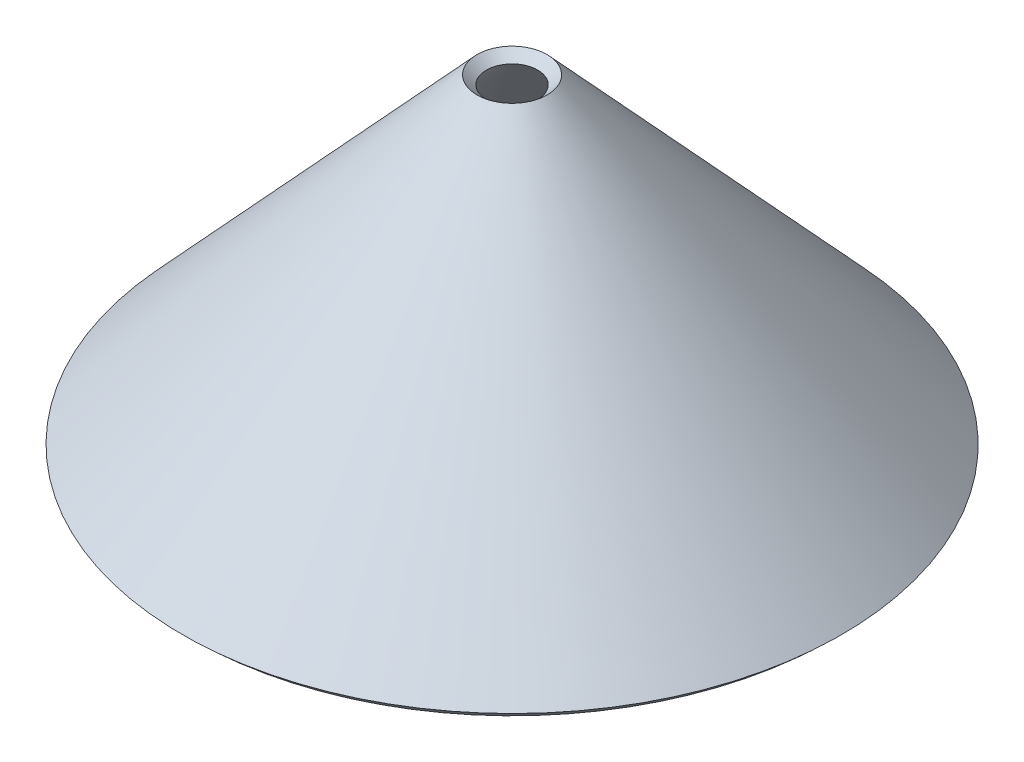
ISO-10303-21;
HEADER;
FILE_DESCRIPTION(('STEP AP214'),'2;1');
FILE_NAME('part.step','',(''),(''),'','','');
FILE_SCHEMA(('AUTOMOTIVE_DESIGN { 1 0 10303 214 1 1 1 1 }'));
ENDSEC;
DATA;
#1=APPLICATION_CONTEXT('core data for automotive mechanical design processes');
#2=APPLICATION_PROTOCOL_DEFINITION('international standard','automotive_design',2000,#1);
#3=PRODUCT_CONTEXT('',#1,'mechanical');
#4=PRODUCT('Part','Part','',(#3));
#5=PRODUCT_RELATED_PRODUCT_CATEGORY('part','',(#4));
#6=PRODUCT_DEFINITION_FORMATION('','',#4);
#7=PRODUCT_DEFINITION_CONTEXT('part definition',#1,'design');
#8=PRODUCT_DEFINITION('design','',#6,#7);
#9=PRODUCT_DEFINITION_SHAPE('','',#8);
#10=(LENGTH_UNIT() NAMED_UNIT(*) SI_UNIT(.MILLI.,.METRE.));
#11=(NAMED_UNIT(*) PLANE_ANGLE_UNIT() SI_UNIT($,.RADIAN.));
#12=(NAMED_UNIT(*) SI_UNIT($,.STERADIAN.) SOLID_ANGLE_UNIT());
#13=UNCERTAINTY_MEASURE_WITH_UNIT(LENGTH_MEASURE(1.E-05),#10,'distance_accuracy_value','');
#14=(GEOMETRIC_REPRESENTATION_CONTEXT(3) GLOBAL_UNCERTAINTY_ASSIGNED_CONTEXT((#13)) GLOBAL_UNIT_ASSIGNED_CONTEXT((#10,
#11,#12)) REPRESENTATION_CONTEXT('',''));
#15=CARTESIAN_POINT('',(0.,0.,0.));
#16=DIRECTION('',(0.,0.,1.));
#17=DIRECTION('',(1.,0.,0.));
#18=AXIS2_PLACEMENT_3D('',#15,#16,#17);
#19=CARTESIAN_POINT('',(0.,17.1972358828504,0.));
#20=DIRECTION('',(0.,-1.,0.));
#21=DIRECTION('',(0.,0.,-1.));
#22=AXIS2_PLACEMENT_3D('',#19,#20,#21);
#23=CONICAL_SURFACE('',#22,69.4926476987505,0.74375558429886);
#24=CARTESIAN_POINT('',(0.,-617.80276411715,0.));
#25=DIRECTION('',(0.,1.,0.));
#26=DIRECTION('',(0.,0.,1.));
#27=AXIS2_PLACEMENT_3D('',#24,#25,#26);
#28=CIRCLE('',#27,653.69264769875);
#29=CARTESIAN_POINT('',(0.,-617.80276411715,-653.692647698751));
#30=VERTEX_POINT('',#29);
#31=EDGE_CURVE('E54',#30,#30,#28,.T.);
#32=CARTESIAN_POINT('',(0.,17.1972358828504,0.));
#33=DIRECTION('',(0.,1.,0.));
#34=DIRECTION('',(0.,0.,1.));
#35=AXIS2_PLACEMENT_3D('',#32,#33,#34);
#36=CIRCLE('',#35,69.4926476987505);
#37=CARTESIAN_POINT('',(0.,17.1972358828504,-69.4926476987505));
#38=VERTEX_POINT('',#37);
#39=EDGE_CURVE('E12',#38,#38,#36,.T.);
#40=CARTESIAN_POINT('',(0.,-617.80276411715,-653.692647698751));
#41=CARTESIAN_POINT('',(0.,-611.188180783816,-647.607231032084));
#42=CARTESIAN_POINT('',(0.,-604.573597450483,-641.521814365417));
#43=CARTESIAN_POINT('',(0.,-591.344430783816,-629.350981032084));
#44=CARTESIAN_POINT('',(0.,-584.729847450483,-623.265564365417));
#45=CARTESIAN_POINT('',(0.,-571.500680783816,-611.094731032084));
#46=CARTESIAN_POINT('',(0.,-564.886097450483,-605.009314365417));
#47=CARTESIAN_POINT('',(0.,-551.656930783816,-592.838481032084));
#48=CARTESIAN_POINT('',(0.,-545.042347450483,-586.753064365417));
#49=CARTESIAN_POINT('',(0.,-531.813180783816,-574.582231032084));
#50=CARTESIAN_POINT('',(0.,-525.198597450483,-568.496814365417));
#51=CARTESIAN_POINT('',(0.,-511.969430783816,-556.325981032084));
#52=CARTESIAN_POINT('',(0.,-505.354847450483,-550.240564365417));
#53=CARTESIAN_POINT('',(0.,-492.125680783816,-538.069731032084));
#54=CARTESIAN_POINT('',(0.,-485.511097450483,-531.984314365417));
#55=CARTESIAN_POINT('',(0.,-472.281930783816,-519.813481032084));
#56=CARTESIAN_POINT('',(0.,-465.667347450483,-513.728064365417));
#57=CARTESIAN_POINT('',(0.,-452.438180783816,-501.557231032084));
#58=CARTESIAN_POINT('',(0.,-445.823597450483,-495.471814365417));
#59=CARTESIAN_POINT('',(0.,-432.594430783816,-483.300981032084));
#60=CARTESIAN_POINT('',(0.,-425.979847450483,-477.215564365417));
#61=CARTESIAN_POINT('',(0.,-412.750680783816,-465.044731032084));
#62=CARTESIAN_POINT('',(0.,-406.136097450483,-458.959314365417));
#63=CARTESIAN_POINT('',(0.,-392.906930783816,-446.788481032084));
#64=CARTESIAN_POINT('',(0.,-386.292347450483,-440.703064365417));
#65=CARTESIAN_POINT('',(0.,-373.063180783816,-428.532231032084));
#66=CARTESIAN_POINT('',(0.,-366.448597450483,-422.446814365417));
#67=CARTESIAN_POINT('',(0.,-353.219430783816,-410.275981032084));
#68=CARTESIAN_POINT('',(0.,-346.604847450483,-404.190564365417));
#69=CARTESIAN_POINT('',(0.,-333.375680783816,-392.019731032084));
#70=CARTESIAN_POINT('',(0.,-326.761097450483,-385.934314365417));
#71=CARTESIAN_POINT('',(0.,-313.531930783816,-373.763481032084));
#72=CARTESIAN_POINT('',(0.,-306.917347450483,-367.678064365417));
#73=CARTESIAN_POINT('',(0.,-293.688180783816,-355.507231032084));
#74=CARTESIAN_POINT('',(0.,-287.073597450483,-349.421814365417));
#75=CARTESIAN_POINT('',(0.,-273.844430783816,-337.250981032084));
#76=CARTESIAN_POINT('',(0.,-267.229847450483,-331.165564365417));
#77=CARTESIAN_POINT('',(0.,-254.000680783816,-318.994731032084));
#78=CARTESIAN_POINT('',(0.,-247.386097450483,-312.909314365417));
#79=CARTESIAN_POINT('',(0.,-234.156930783816,-300.738481032084));
#80=CARTESIAN_POINT('',(0.,-227.542347450483,-294.653064365417));
#81=CARTESIAN_POINT('',(0.,-214.313180783816,-282.482231032084));
#82=CARTESIAN_POINT('',(0.,-207.698597450483,-276.396814365417));
#83=CARTESIAN_POINT('',(0.,-194.469430783816,-264.225981032084));
#84=CARTESIAN_POINT('',(0.,-187.854847450483,-258.140564365417));
#85=CARTESIAN_POINT('',(0.,-174.625680783816,-245.969731032084));
#86=CARTESIAN_POINT('',(0.,-168.011097450483,-239.884314365417));
#87=CARTESIAN_POINT('',(0.,-154.781930783816,-227.713481032084));
#88=CARTESIAN_POINT('',(0.,-148.167347450483,-221.628064365417));
#89=CARTESIAN_POINT('',(0.,-134.938180783816,-209.457231032084));
#90=CARTESIAN_POINT('',(0.,-128.323597450483,-203.371814365417));
#91=CARTESIAN_POINT('',(0.,-115.094430783816,-191.200981032084));
#92=CARTESIAN_POINT('',(0.,-108.479847450483,-185.115564365417));
#93=CARTESIAN_POINT('',(0.,-95.2506807838162,-172.944731032084));
#94=CARTESIAN_POINT('',(0.,-88.6360974504829,-166.859314365417));
#95=CARTESIAN_POINT('',(0.,-75.4069307838162,-154.688481032084));
#96=CARTESIAN_POINT('',(0.,-68.7923474504829,-148.603064365417));
#97=CARTESIAN_POINT('',(0.,-55.5631807838162,-136.432231032084));
#98=CARTESIAN_POINT('',(0.,-48.9485974504829,-130.346814365417));
#99=CARTESIAN_POINT('',(0.,-35.7194307838162,-118.175981032084));
#100=CARTESIAN_POINT('',(0.,-29.1048474504829,-112.090564365417));
#101=CARTESIAN_POINT('',(0.,-15.8756807838162,-99.9197310320838));
#102=CARTESIAN_POINT('',(0.,-9.26109745048291,-93.8343143654172));
#103=CARTESIAN_POINT('',(0.,3.96806921618374,-81.6634810320838));
#104=CARTESIAN_POINT('',(0.,10.5826525495171,-75.5780643654171));
#105=CARTESIAN_POINT('',(0.,17.1972358828504,-69.4926476987505));
#106=B_SPLINE_CURVE_WITH_KNOTS('',3,(#40,#41,#42,#43,#44,#45,#46,#47,#48,#49,#50,#51,#52,#53,
#54,#55,#56,#57,#58,#59,#60,#61,#62,#63,#64,#65,#66,#67,#68,#69,#70,#71,#72,#73,#74,#75,#76,#77,
#78,#79,#80,#81,#82,#83,#84,#85,#86,#87,#88,#89,#90,#91,#92,#93,#94,#95,#96,#97,#98,#99,#100,
#101,#102,#103,#104,#105),.UNSPECIFIED.,.F.,.F.,(4,2,2,2,2,2,2,2,2,2,2,2,2,2,2,2,2,2,2,2,2,2,2,
2,2,2,2,2,2,2,2,2,4),(0.,26.9641443054477,53.9282886108951,80.8924329163427,107.85657722179,
134.820721527238,161.784865832685,188.749010138133,215.71315444358,242.677298749028,
269.641443054476,296.605587359923,323.569731665371,350.533875970818,377.498020276266,
404.462164581713,431.426308887161,458.390453192609,485.354597498056,512.318741803504,
539.282886108951,566.247030414399,593.211174719847,620.175319025294,647.139463330742,
674.103607636189,701.067751941637,728.031896247084,754.996040552532,781.960184857979,
808.924329163427,835.888473468874,862.852617774322),.UNSPECIFIED.);
#107=EDGE_CURVE('BSEAM40',#30,#38,#106,.T.);
#108=ORIENTED_EDGE('',*,*,#31,.T.);
#109=ORIENTED_EDGE('',*,*,#39,.F.);
#110=ORIENTED_EDGE('',*,*,#107,.T.);
#111=ORIENTED_EDGE('',*,*,#107,.F.);
#112=EDGE_LOOP('',(#108,#110,#109,#111));
#113=FACE_BOUND('',#112,.T.);
#114=ADVANCED_FACE('F40',(#113),#23,.T.);
#115=CARTESIAN_POINT('',(0.,17.1972358828504,0.));
#116=DIRECTION('',(0.,1.,0.));
#117=DIRECTION('',(0.,0.,1.));
#118=AXIS2_PLACEMENT_3D('',#115,#116,#117);
#119=CONICAL_SURFACE('',#118,69.4926476987505,0.827040742496037);
#120=CARTESIAN_POINT('',(0.,0.,0.));
#121=DIRECTION('',(0.,1.,0.));
#122=DIRECTION('',(0.,0.,1.));
#123=AXIS2_PLACEMENT_3D('',#120,#121,#122);
#124=CIRCLE('',#123,50.8);
#125=CARTESIAN_POINT('',(0.,0.,-50.8));
#126=VERTEX_POINT('',#125);
#127=EDGE_CURVE('E46',#126,#126,#124,.T.);
#128=ORIENTED_EDGE('',*,*,#127,.F.);
#129=EDGE_LOOP('',(#128));
#130=FACE_BOUND('',#129,.T.);
#131=ORIENTED_EDGE('',*,*,#39,.T.);
#132=EDGE_LOOP('',(#131));
#133=FACE_BOUND('',#132,.T.);
#134=ADVANCED_FACE('F70',(#130,#133),#119,.F.);
#135=CARTESIAN_POINT('',(0.,0.,0.));
#136=DIRECTION('',(0.,-1.,0.));
#137=DIRECTION('',(0.,0.,-1.));
#138=AXIS2_PLACEMENT_3D('',#135,#136,#137);
#139=CONICAL_SURFACE('',#138,50.8,0.74375558429886);
#140=CARTESIAN_POINT('',(0.,-635.,0.));
#141=DIRECTION('',(0.,1.,0.));
#142=DIRECTION('',(0.,0.,1.));
#143=AXIS2_PLACEMENT_3D('',#140,#141,#142);
#144=CIRCLE('',#143,635.);
#145=CARTESIAN_POINT('',(0.,-635.,-635.));
#146=VERTEX_POINT('',#145);
#147=EDGE_CURVE('E50',#146,#146,#144,.T.);
#148=CARTESIAN_POINT('',(0.,-635.,-635.));
#149=CARTESIAN_POINT('',(0.,-628.385416666667,-628.914583333334));
#150=CARTESIAN_POINT('',(0.,-621.770833333333,-622.829166666667));
#151=CARTESIAN_POINT('',(0.,-608.541666666667,-610.658333333334));
#152=CARTESIAN_POINT('',(0.,-601.927083333333,-604.572916666667));
#153=CARTESIAN_POINT('',(0.,-588.697916666667,-592.402083333333));
#154=CARTESIAN_POINT('',(0.,-582.083333333333,-586.316666666667));
#155=CARTESIAN_POINT('',(0.,-568.854166666667,-574.145833333333));
#156=CARTESIAN_POINT('',(0.,-562.239583333333,-568.060416666667));
#157=CARTESIAN_POINT('',(0.,-549.010416666667,-555.889583333333));
#158=CARTESIAN_POINT('',(0.,-542.395833333333,-549.804166666667));
#159=CARTESIAN_POINT('',(0.,-529.166666666667,-537.633333333334));
#160=CARTESIAN_POINT('',(0.,-522.552083333333,-531.547916666667));
#161=CARTESIAN_POINT('',(0.,-509.322916666667,-519.377083333334));
#162=CARTESIAN_POINT('',(0.,-502.708333333333,-513.291666666667));
#163=CARTESIAN_POINT('',(0.,-489.479166666667,-501.120833333334));
#164=CARTESIAN_POINT('',(0.,-482.864583333333,-495.035416666667));
#165=CARTESIAN_POINT('',(0.,-469.635416666667,-482.864583333333));
#166=CARTESIAN_POINT('',(0.,-463.020833333333,-476.779166666667));
#167=CARTESIAN_POINT('',(0.,-449.791666666667,-464.608333333333));
#168=CARTESIAN_POINT('',(0.,-443.177083333333,-458.522916666667));
#169=CARTESIAN_POINT('',(0.,-429.947916666667,-446.352083333333));
#170=CARTESIAN_POINT('',(0.,-423.333333333333,-440.266666666667));
#171=CARTESIAN_POINT('',(0.,-410.104166666667,-428.095833333333));
#172=CARTESIAN_POINT('',(0.,-403.489583333333,-422.010416666667));
#173=CARTESIAN_POINT('',(0.,-390.260416666667,-409.839583333333));
#174=CARTESIAN_POINT('',(0.,-383.645833333333,-403.754166666667));
#175=CARTESIAN_POINT('',(0.,-370.416666666667,-391.583333333333));
#176=CARTESIAN_POINT('',(0.,-363.802083333333,-385.497916666667));
#177=CARTESIAN_POINT('',(0.,-350.572916666667,-373.327083333333));
#178=CARTESIAN_POINT('',(0.,-343.958333333333,-367.241666666667));
#179=CARTESIAN_POINT('',(0.,-330.729166666667,-355.070833333333));
#180=CARTESIAN_POINT('',(0.,-324.114583333333,-348.985416666667));
#181=CARTESIAN_POINT('',(0.,-310.885416666667,-336.814583333333));
#182=CARTESIAN_POINT('',(0.,-304.270833333333,-330.729166666667));
#183=CARTESIAN_POINT('',(0.,-291.041666666667,-318.558333333333));
#184=CARTESIAN_POINT('',(0.,-284.427083333333,-312.472916666667));
#185=CARTESIAN_POINT('',(0.,-271.197916666667,-300.302083333333));
#186=CARTESIAN_POINT('',(0.,-264.583333333333,-294.216666666667));
#187=CARTESIAN_POINT('',(0.,-251.354166666667,-282.045833333333));
#188=CARTESIAN_POINT('',(0.,-244.739583333333,-275.960416666667));
#189=CARTESIAN_POINT('',(0.,-231.510416666667,-263.789583333333));
#190=CARTESIAN_POINT('',(0.,-224.895833333333,-257.704166666667));
#191=CARTESIAN_POINT('',(0.,-211.666666666667,-245.533333333333));
#192=CARTESIAN_POINT('',(0.,-205.052083333333,-239.447916666667));
#193=CARTESIAN_POINT('',(0.,-191.822916666667,-227.277083333333));
#194=CARTESIAN_POINT('',(0.,-185.208333333333,-221.191666666667));
#195=CARTESIAN_POINT('',(0.,-171.979166666667,-209.020833333333));
#196=CARTESIAN_POINT('',(0.,-165.364583333333,-202.935416666667));
#197=CARTESIAN_POINT('',(0.,-152.135416666667,-190.764583333333));
#198=CARTESIAN_POINT('',(0.,-145.520833333333,-184.679166666667));
#199=CARTESIAN_POINT('',(0.,-132.291666666667,-172.508333333333));
#200=CARTESIAN_POINT('',(0.,-125.677083333333,-166.422916666667));
#201=CARTESIAN_POINT('',(0.,-112.447916666667,-154.252083333333));
#202=CARTESIAN_POINT('',(0.,-105.833333333333,-148.166666666667));
#203=CARTESIAN_POINT('',(0.,-92.6041666666667,-135.995833333333));
#204=CARTESIAN_POINT('',(0.,-85.9895833333333,-129.910416666667));
#205=CARTESIAN_POINT('',(0.,-72.7604166666666,-117.739583333333));
#206=CARTESIAN_POINT('',(0.,-66.1458333333333,-111.654166666667));
#207=CARTESIAN_POINT('',(0.,-52.9166666666667,-99.4833333333334));
#208=CARTESIAN_POINT('',(0.,-46.3020833333333,-93.3979166666667));
#209=CARTESIAN_POINT('',(0.,-33.0729166666667,-81.2270833333333));
#210=CARTESIAN_POINT('',(0.,-26.4583333333334,-75.1416666666667));
#211=CARTESIAN_POINT('',(0.,-13.2291666666667,-62.9708333333334));
#212=CARTESIAN_POINT('',(0.,-6.61458333333334,-56.8854166666667));
#213=CARTESIAN_POINT('',(0.,0.,-50.8));
#214=B_SPLINE_CURVE_WITH_KNOTS('',3,(#148,#149,#150,#151,#152,#153,#154,#155,#156,#157,#158,
#159,#160,#161,#162,#163,#164,#165,#166,#167,#168,#169,#170,#171,#172,#173,#174,#175,#176,#177,
#178,#179,#180,#181,#182,#183,#184,#185,#186,#187,#188,#189,#190,#191,#192,#193,#194,#195,#196,
#197,#198,#199,#200,#201,#202,#203,#204,#205,#206,#207,#208,#209,#210,#211,#212,#213),
.UNSPECIFIED.,.F.,.F.,(4,2,2,2,2,2,2,2,2,2,2,2,2,2,2,2,2,2,2,2,2,2,2,2,2,2,2,2,2,2,2,2,4),(0.,
26.9641443054476,53.9282886108951,80.8924329163427,107.85657722179,134.820721527238,
161.784865832685,188.749010138133,215.71315444358,242.677298749028,269.641443054476,
296.605587359923,323.569731665371,350.533875970818,377.498020276266,404.462164581713,
431.426308887161,458.390453192608,485.354597498056,512.318741803504,539.282886108951,
566.247030414399,593.211174719846,620.175319025294,647.139463330741,674.103607636189,
701.067751941637,728.031896247084,754.996040552532,781.960184857979,808.924329163427,
835.888473468874,862.852617774322),.UNSPECIFIED.);
#215=EDGE_CURVE('BSEAM65',#146,#126,#214,.T.);
#216=ORIENTED_EDGE('',*,*,#147,.F.);
#217=ORIENTED_EDGE('',*,*,#127,.T.);
#218=ORIENTED_EDGE('',*,*,#215,.T.);
#219=ORIENTED_EDGE('',*,*,#215,.F.);
#220=EDGE_LOOP('',(#216,#218,#217,#219));
#221=FACE_BOUND('',#220,.T.);
#222=ADVANCED_FACE('F65',(#221),#139,.F.);
#223=CARTESIAN_POINT('',(0.,-635.,0.));
#224=DIRECTION('',(0.,1.,0.));
#225=DIRECTION('',(0.,0.,1.));
#226=AXIS2_PLACEMENT_3D('',#223,#224,#225);
#227=CONICAL_SURFACE('',#226,635.,0.827040742496038);
#228=ORIENTED_EDGE('',*,*,#31,.F.);
#229=EDGE_LOOP('',(#228));
#230=FACE_BOUND('',#229,.T.);
#231=ORIENTED_EDGE('',*,*,#147,.T.);
#232=EDGE_LOOP('',(#231));
#233=FACE_BOUND('',#232,.T.);
#234=ADVANCED_FACE('F62',(#230,#233),#227,.T.);
#235=CLOSED_SHELL('',(#114,#134,#222,#234));
#236=MANIFOLD_SOLID_BREP('B2',#235);
#237=ADVANCED_BREP_SHAPE_REPRESENTATION('',(#18,#236),#14);
#238=SHAPE_DEFINITION_REPRESENTATION(#9,#237);
ENDSEC;
END-ISO-10303-21;
